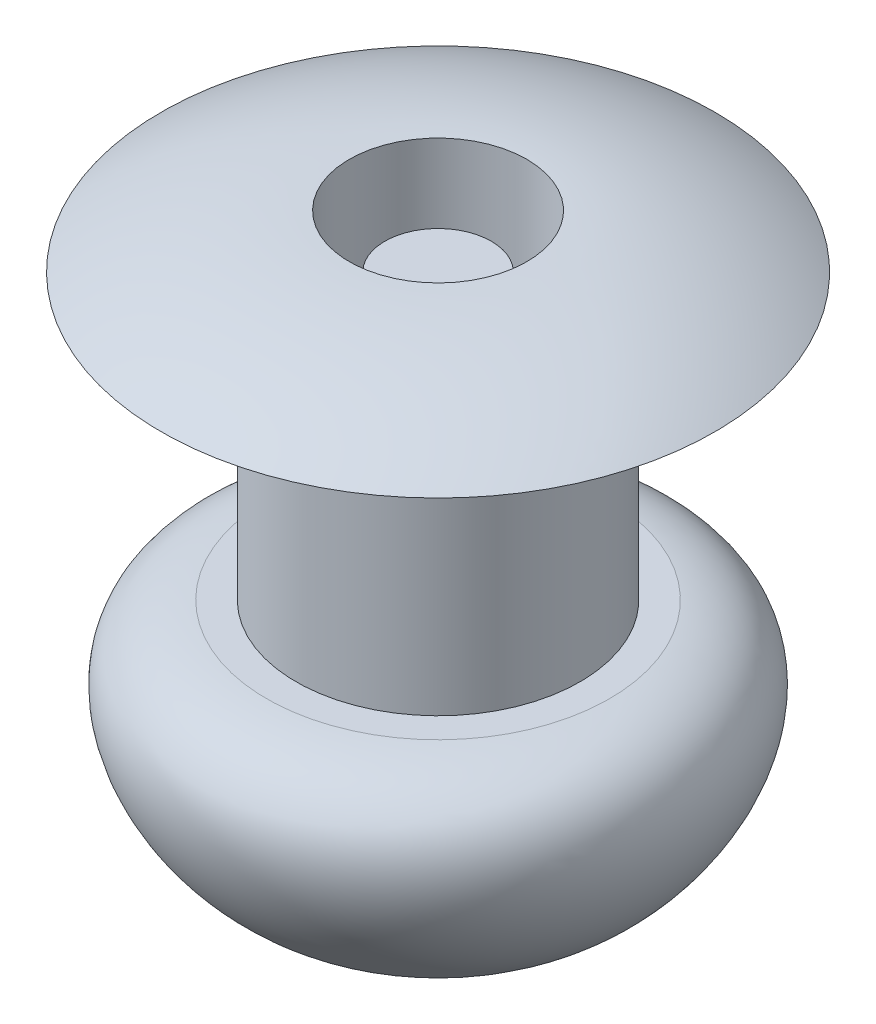
ISO-10303-21;
HEADER;
FILE_DESCRIPTION(('STEP AP214'),'2;1');
FILE_NAME('part.step','',(''),(''),'','','');
FILE_SCHEMA(('AUTOMOTIVE_DESIGN { 1 0 10303 214 1 1 1 1 }'));
ENDSEC;
DATA;
#1=APPLICATION_CONTEXT('core data for automotive mechanical design processes');
#2=APPLICATION_PROTOCOL_DEFINITION('international standard','automotive_design',2000,#1);
#3=PRODUCT_CONTEXT('',#1,'mechanical');
#4=PRODUCT('Part','Part','',(#3));
#5=PRODUCT_RELATED_PRODUCT_CATEGORY('part','',(#4));
#6=PRODUCT_DEFINITION_FORMATION('','',#4);
#7=PRODUCT_DEFINITION_CONTEXT('part definition',#1,'design');
#8=PRODUCT_DEFINITION('design','',#6,#7);
#9=PRODUCT_DEFINITION_SHAPE('','',#8);
#10=(LENGTH_UNIT() NAMED_UNIT(*) SI_UNIT(.MILLI.,.METRE.));
#11=(NAMED_UNIT(*) PLANE_ANGLE_UNIT() SI_UNIT($,.RADIAN.));
#12=(NAMED_UNIT(*) SI_UNIT($,.STERADIAN.) SOLID_ANGLE_UNIT());
#13=UNCERTAINTY_MEASURE_WITH_UNIT(LENGTH_MEASURE(1.E-05),#10,'distance_accuracy_value','');
#14=(GEOMETRIC_REPRESENTATION_CONTEXT(3) GLOBAL_UNCERTAINTY_ASSIGNED_CONTEXT((#13)) GLOBAL_UNIT_ASSIGNED_CONTEXT((#10,
#11,#12)) REPRESENTATION_CONTEXT('',''));
#15=CARTESIAN_POINT('',(0.,0.,0.));
#16=DIRECTION('',(0.,0.,1.));
#17=DIRECTION('',(1.,0.,0.));
#18=AXIS2_PLACEMENT_3D('',#15,#16,#17);
#19=CARTESIAN_POINT('',(0.,0.,0.));
#20=DIRECTION('',(0.,-1.,0.));
#21=DIRECTION('',(0.,0.,-1.));
#22=AXIS2_PLACEMENT_3D('',#19,#20,#21);
#23=PLANE('',#22);
#24=CARTESIAN_POINT('',(0.,0.,0.));
#25=DIRECTION('',(0.,-1.,0.));
#26=DIRECTION('',(0.,0.,-1.));
#27=AXIS2_PLACEMENT_3D('',#24,#25,#26);
#28=CIRCLE('',#27,0.75);
#29=CARTESIAN_POINT('',(0.,0.,-0.75));
#30=VERTEX_POINT('',#29);
#31=EDGE_CURVE('E11',#30,#30,#28,.T.);
#32=ORIENTED_EDGE('',*,*,#31,.F.);
#33=EDGE_LOOP('',(#32));
#34=FACE_BOUND('',#33,.T.);
#35=ADVANCED_FACE('F33',(#34),#23,.F.);
#36=CARTESIAN_POINT('',(0.,0.,0.));
#37=DIRECTION('',(0.,-1.,0.));
#38=DIRECTION('',(0.,0.,-1.));
#39=AXIS2_PLACEMENT_3D('',#36,#37,#38);
#40=CYLINDRICAL_SURFACE('',#39,0.75);
#41=CARTESIAN_POINT('',(0.,-4.00000000000078,0.));
#42=DIRECTION('',(0.,-1.,0.));
#43=DIRECTION('',(0.,0.,-1.));
#44=AXIS2_PLACEMENT_3D('',#41,#42,#43);
#45=CIRCLE('',#44,0.749999999999999);
#46=CARTESIAN_POINT('',(0.,-4.00000000000078,-0.749999999999999));
#47=VERTEX_POINT('',#46);
#48=EDGE_CURVE('E39',#47,#47,#45,.T.);
#49=ORIENTED_EDGE('',*,*,#48,.F.);
#50=EDGE_LOOP('',(#49));
#51=FACE_BOUND('',#50,.T.);
#52=ORIENTED_EDGE('',*,*,#31,.T.);
#53=EDGE_LOOP('',(#52));
#54=FACE_BOUND('',#53,.T.);
#55=ADVANCED_FACE('F78',(#51,#54),#40,.T.);
#56=CARTESIAN_POINT('',(0.,-4.00000000000078,0.750000000000028));
#57=DIRECTION('',(0.,-1.,0.));
#58=DIRECTION('',(0.,0.,-1.));
#59=AXIS2_PLACEMENT_3D('',#56,#57,#58);
#60=PLANE('',#59);
#61=CARTESIAN_POINT('',(0.,-4.00000000000078,0.));
#62=DIRECTION('',(0.,-1.,0.));
#63=DIRECTION('',(0.,0.,-1.));
#64=AXIS2_PLACEMENT_3D('',#61,#62,#63);
#65=CIRCLE('',#64,1.25);
#66=CARTESIAN_POINT('',(0.,-4.00000000000078,-1.25));
#67=VERTEX_POINT('',#66);
#68=EDGE_CURVE('E71',#67,#67,#65,.T.);
#69=ORIENTED_EDGE('',*,*,#68,.F.);
#70=EDGE_LOOP('',(#69));
#71=FACE_BOUND('',#70,.T.);
#72=ORIENTED_EDGE('',*,*,#48,.T.);
#73=EDGE_LOOP('',(#72));
#74=FACE_BOUND('',#73,.T.);
#75=ADVANCED_FACE('F76',(#71,#74),#60,.F.);
#76=CARTESIAN_POINT('',(0.,0.,0.));
#77=DIRECTION('',(0.,-1.,0.));
#78=DIRECTION('',(0.,0.,-1.));
#79=AXIS2_PLACEMENT_3D('',#76,#77,#78);
#80=CYLINDRICAL_SURFACE('',#79,1.25);
#81=CARTESIAN_POINT('',(0.,0.749999999999973,0.));
#82=DIRECTION('',(0.,-1.,0.));
#83=DIRECTION('',(0.,0.,-1.));
#84=AXIS2_PLACEMENT_3D('',#81,#82,#83);
#85=CIRCLE('',#84,1.25);
#86=CARTESIAN_POINT('',(0.,0.749999999999973,-1.25));
#87=VERTEX_POINT('',#86);
#88=EDGE_CURVE('E68',#87,#87,#85,.T.);
#89=ORIENTED_EDGE('',*,*,#88,.F.);
#90=EDGE_LOOP('',(#89));
#91=FACE_BOUND('',#90,.T.);
#92=ORIENTED_EDGE('',*,*,#68,.T.);
#93=EDGE_LOOP('',(#92));
#94=FACE_BOUND('',#93,.T.);
#95=ADVANCED_FACE('F96',(#91,#94),#80,.F.);
#96=CARTESIAN_POINT('',(0.,-4.30666666666668,0.));
#97=DIRECTION('',(0.,-1.,0.));
#98=DIRECTION('',(0.,0.,-1.));
#99=AXIS2_PLACEMENT_3D('',#96,#97,#98);
#100=DEGENERATE_TOROIDAL_SURFACE('',#99,1.25,5.05666666666667,.T.);
#101=CARTESIAN_POINT('',(0.,0.,0.));
#102=DIRECTION('',(0.,-1.,0.));
#103=DIRECTION('',(0.,0.,-1.));
#104=AXIS2_PLACEMENT_3D('',#101,#102,#103);
#105=CIRCLE('',#104,3.9);
#106=CARTESIAN_POINT('',(0.,0.,-3.9));
#107=VERTEX_POINT('',#106);
#108=EDGE_CURVE('E65',#107,#107,#105,.T.);
#109=ORIENTED_EDGE('',*,*,#108,.F.);
#110=EDGE_LOOP('',(#109));
#111=FACE_BOUND('',#110,.T.);
#112=ORIENTED_EDGE('',*,*,#88,.T.);
#113=EDGE_LOOP('',(#112));
#114=FACE_BOUND('',#113,.T.);
#115=ADVANCED_FACE('F104',(#111,#114),#100,.T.);
#116=CARTESIAN_POINT('',(0.,0.,3.90000000000001));
#117=DIRECTION('',(0.,1.,0.));
#118=DIRECTION('',(0.,0.,1.));
#119=AXIS2_PLACEMENT_3D('',#116,#117,#118);
#120=PLANE('',#119);
#121=CARTESIAN_POINT('',(0.,0.,0.));
#122=DIRECTION('',(0.,-1.,0.));
#123=DIRECTION('',(0.,0.,-1.));
#124=AXIS2_PLACEMENT_3D('',#121,#122,#123);
#125=CIRCLE('',#124,2.);
#126=CARTESIAN_POINT('',(0.,0.,-2.));
#127=VERTEX_POINT('',#126);
#128=EDGE_CURVE('E62',#127,#127,#125,.T.);
#129=ORIENTED_EDGE('',*,*,#128,.F.);
#130=EDGE_LOOP('',(#129));
#131=FACE_BOUND('',#130,.T.);
#132=ORIENTED_EDGE('',*,*,#108,.T.);
#133=EDGE_LOOP('',(#132));
#134=FACE_BOUND('',#133,.T.);
#135=ADVANCED_FACE('F112',(#131,#134),#120,.F.);
#136=CARTESIAN_POINT('',(0.,0.,0.));
#137=DIRECTION('',(0.,-1.,0.));
#138=DIRECTION('',(0.,0.,-1.));
#139=AXIS2_PLACEMENT_3D('',#136,#137,#138);
#140=CYLINDRICAL_SURFACE('',#139,2.);
#141=CARTESIAN_POINT('',(0.,-4.00000000000078,0.));
#142=DIRECTION('',(0.,-1.,0.));
#143=DIRECTION('',(0.,0.,-1.));
#144=AXIS2_PLACEMENT_3D('',#141,#142,#143);
#145=CIRCLE('',#144,2.);
#146=CARTESIAN_POINT('',(0.,-4.00000000000078,-2.));
#147=VERTEX_POINT('',#146);
#148=EDGE_CURVE('E54',#147,#147,#145,.T.);
#149=ORIENTED_EDGE('',*,*,#148,.F.);
#150=EDGE_LOOP('',(#149));
#151=FACE_BOUND('',#150,.T.);
#152=ORIENTED_EDGE('',*,*,#128,.T.);
#153=EDGE_LOOP('',(#152));
#154=FACE_BOUND('',#153,.T.);
#155=ADVANCED_FACE('F120',(#151,#154),#140,.T.);
#156=CARTESIAN_POINT('',(0.,-4.00000000000078,2.));
#157=DIRECTION('',(0.,-1.,0.));
#158=DIRECTION('',(0.,0.,-1.));
#159=AXIS2_PLACEMENT_3D('',#156,#157,#158);
#160=PLANE('',#159);
#161=CARTESIAN_POINT('',(0.,-4.00000000000078,0.));
#162=DIRECTION('',(0.,-1.,0.));
#163=DIRECTION('',(0.,0.,-1.));
#164=AXIS2_PLACEMENT_3D('',#161,#162,#163);
#165=CIRCLE('',#164,2.4138917546613);
#166=CARTESIAN_POINT('',(0.,-4.00000000000078,-2.4138917546613));
#167=VERTEX_POINT('',#166);
#168=EDGE_CURVE('E51',#167,#167,#165,.T.);
#169=ORIENTED_EDGE('',*,*,#168,.F.);
#170=EDGE_LOOP('',(#169));
#171=FACE_BOUND('',#170,.T.);
#172=ORIENTED_EDGE('',*,*,#148,.T.);
#173=EDGE_LOOP('',(#172));
#174=FACE_BOUND('',#173,.T.);
#175=ADVANCED_FACE('F128',(#171,#174),#160,.F.);
#176=CARTESIAN_POINT('',(0.,-4.00000000000078,2.41389175466133));
#177=CARTESIAN_POINT('',(0.,-4.16329668629278,3.85855943689817));
#178=CARTESIAN_POINT('',(-9.99200722162641E-13,-6.32298036215101,3.55835892789558));
#179=CARTESIAN_POINT('',(-9.99200722162641E-13,-7.87194001622449,0.971318098259233));
#180=CARTESIAN_POINT('',(-9.99200722162641E-13,-5.79203190958277,0.341145137497501));
#181=CARTESIAN_POINT('',(-9.99200722162641E-13,-5.37819067059142,0.956030426512489));
#182=B_SPLINE_CURVE_WITH_KNOTS('',3,(#176,#177,#178,#179,#180,#181),.UNSPECIFIED.,.F.,.F.,(4,1,
1,4),(0.,0.454219308299973,0.705200671734253,1.),.UNSPECIFIED.);
#183=CARTESIAN_POINT('',(0.,0.,0.));
#184=DIRECTION('',(0.,-1.,0.));
#185=AXIS1_PLACEMENT('',#183,#184);
#186=SURFACE_OF_REVOLUTION('',#182,#185);
#187=CARTESIAN_POINT('',(-9.99200722162641E-13,-5.37819067059142,0.));
#188=DIRECTION('',(0.,-1.,0.));
#189=DIRECTION('',(0.,0.,-1.));
#190=AXIS2_PLACEMENT_3D('',#187,#188,#189);
#191=CIRCLE('',#190,0.956030426512504);
#192=CARTESIAN_POINT('',(-1.00174809894286E-12,-5.37819067059142,-0.956030426512504));
#193=VERTEX_POINT('',#192);
#194=EDGE_CURVE('E49',#193,#193,#191,.T.);
#195=ORIENTED_EDGE('',*,*,#194,.F.);
#196=EDGE_LOOP('',(#195));
#197=FACE_BOUND('',#196,.T.);
#198=ORIENTED_EDGE('',*,*,#168,.T.);
#199=EDGE_LOOP('',(#198));
#200=FACE_BOUND('',#199,.T.);
#201=ADVANCED_FACE('F45',(#197,#200),#186,.T.);
#202=CARTESIAN_POINT('',(0.,-4.75000000000075,0.));
#203=DIRECTION('',(1.,0.,0.));
#204=DIRECTION('',(0.,0.,1.));
#205=AXIS2_PLACEMENT_3D('',#202,#203,#204);
#206=ELLIPSE('',#205,1.75,0.749999999999999);
#207=TRIMMED_CURVE('',#206,(PARAMETER_VALUE(-1.5707963267949)),
(PARAMETER_VALUE(1.5707963267949)),.T.,.PARAMETER.);
#208=CARTESIAN_POINT('',(0.,0.,0.));
#209=DIRECTION('',(0.,-1.,0.));
#210=AXIS1_PLACEMENT('',#208,#209);
#211=SURFACE_OF_REVOLUTION('',#207,#210);
#212=CARTESIAN_POINT('',(-9.99200722162641E-13,-5.50000000000078,0.));
#213=VERTEX_POINT('',#212);
#214=VERTEX_LOOP('',#213);
#215=FACE_BOUND('',#214,.T.);
#216=ORIENTED_EDGE('',*,*,#194,.T.);
#217=EDGE_LOOP('',(#216));
#218=FACE_BOUND('',#217,.T.);
#219=ADVANCED_FACE('F42',(#215,#218),#211,.T.);
#220=CLOSED_SHELL('',(#35,#55,#75,#95,#115,#135,#155,#175,#201,#219));
#221=MANIFOLD_SOLID_BREP('B2',#220);
#222=ADVANCED_BREP_SHAPE_REPRESENTATION('',(#18,#221),#14);
#223=SHAPE_DEFINITION_REPRESENTATION(#9,#222);
ENDSEC;
END-ISO-10303-21;
